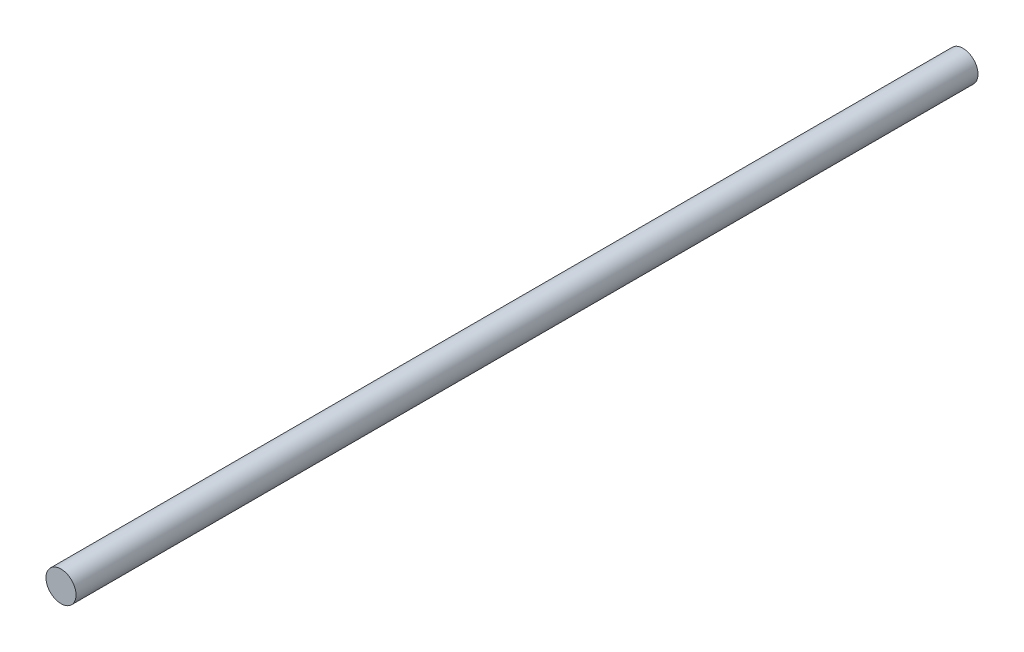
ISO-10303-21;
HEADER;
FILE_DESCRIPTION(('STEP AP214'),'2;1');
FILE_NAME('part.step','',(''),(''),'','','');
FILE_SCHEMA(('AUTOMOTIVE_DESIGN { 1 0 10303 214 1 1 1 1 }'));
ENDSEC;
DATA;
#1=APPLICATION_CONTEXT('core data for automotive mechanical design processes');
#2=APPLICATION_PROTOCOL_DEFINITION('international standard','automotive_design',2000,#1);
#3=PRODUCT_CONTEXT('',#1,'mechanical');
#4=PRODUCT('Part','Part','',(#3));
#5=PRODUCT_RELATED_PRODUCT_CATEGORY('part','',(#4));
#6=PRODUCT_DEFINITION_FORMATION('','',#4);
#7=PRODUCT_DEFINITION_CONTEXT('part definition',#1,'design');
#8=PRODUCT_DEFINITION('design','',#6,#7);
#9=PRODUCT_DEFINITION_SHAPE('','',#8);
#10=(LENGTH_UNIT() NAMED_UNIT(*) SI_UNIT(.MILLI.,.METRE.));
#11=(NAMED_UNIT(*) PLANE_ANGLE_UNIT() SI_UNIT($,.RADIAN.));
#12=(NAMED_UNIT(*) SI_UNIT($,.STERADIAN.) SOLID_ANGLE_UNIT());
#13=UNCERTAINTY_MEASURE_WITH_UNIT(LENGTH_MEASURE(1.E-05),#10,'distance_accuracy_value','');
#14=(GEOMETRIC_REPRESENTATION_CONTEXT(3) GLOBAL_UNCERTAINTY_ASSIGNED_CONTEXT((#13)) GLOBAL_UNIT_ASSIGNED_CONTEXT((#10,
#11,#12)) REPRESENTATION_CONTEXT('',''));
#15=CARTESIAN_POINT('',(0.,0.,0.));
#16=DIRECTION('',(0.,0.,1.));
#17=DIRECTION('',(1.,0.,0.));
#18=AXIS2_PLACEMENT_3D('',#15,#16,#17);
#19=CARTESIAN_POINT('',(0.,0.,60.));
#20=DIRECTION('',(0.,0.,-1.));
#21=DIRECTION('',(-1.,0.,0.));
#22=AXIS2_PLACEMENT_3D('',#19,#20,#21);
#23=CYLINDRICAL_SURFACE('',#22,1.);
#24=CARTESIAN_POINT('',(0.,0.,60.));
#25=DIRECTION('',(0.,0.,1.));
#26=DIRECTION('',(1.,0.,0.));
#27=AXIS2_PLACEMENT_3D('',#24,#25,#26);
#28=CIRCLE('',#27,1.);
#29=CARTESIAN_POINT('',(1.,0.,60.));
#30=VERTEX_POINT('',#29);
#31=EDGE_CURVE('E10',#30,#30,#28,.T.);
#32=ORIENTED_EDGE('',*,*,#31,.F.);
#33=EDGE_LOOP('',(#32));
#34=FACE_BOUND('',#33,.T.);
#35=CARTESIAN_POINT('',(0.,0.,0.));
#36=DIRECTION('',(0.,0.,1.));
#37=DIRECTION('',(1.,0.,0.));
#38=AXIS2_PLACEMENT_3D('',#35,#36,#37);
#39=CIRCLE('',#38,1.);
#40=CARTESIAN_POINT('',(1.,0.,0.));
#41=VERTEX_POINT('',#40);
#42=EDGE_CURVE('E38',#41,#41,#39,.T.);
#43=ORIENTED_EDGE('',*,*,#42,.T.);
#44=EDGE_LOOP('',(#43));
#45=FACE_BOUND('',#44,.T.);
#46=ADVANCED_FACE('F35',(#34,#45),#23,.T.);
#47=CARTESIAN_POINT('',(0.,0.,60.));
#48=DIRECTION('',(0.,0.,1.));
#49=DIRECTION('',(1.,0.,0.));
#50=AXIS2_PLACEMENT_3D('',#47,#48,#49);
#51=PLANE('',#50);
#52=ORIENTED_EDGE('',*,*,#31,.T.);
#53=EDGE_LOOP('',(#52));
#54=FACE_BOUND('',#53,.T.);
#55=ADVANCED_FACE('F50',(#54),#51,.T.);
#56=CARTESIAN_POINT('',(0.,0.,0.));
#57=DIRECTION('',(0.,0.,1.));
#58=DIRECTION('',(1.,0.,0.));
#59=AXIS2_PLACEMENT_3D('',#56,#57,#58);
#60=PLANE('',#59);
#61=ORIENTED_EDGE('',*,*,#42,.F.);
#62=EDGE_LOOP('',(#61));
#63=FACE_BOUND('',#62,.T.);
#64=ADVANCED_FACE('F48',(#63),#60,.F.);
#65=CLOSED_SHELL('',(#46,#55,#64));
#66=MANIFOLD_SOLID_BREP('B2',#65);
#67=ADVANCED_BREP_SHAPE_REPRESENTATION('',(#18,#66),#14);
#68=SHAPE_DEFINITION_REPRESENTATION(#9,#67);
ENDSEC;
END-ISO-10303-21;
